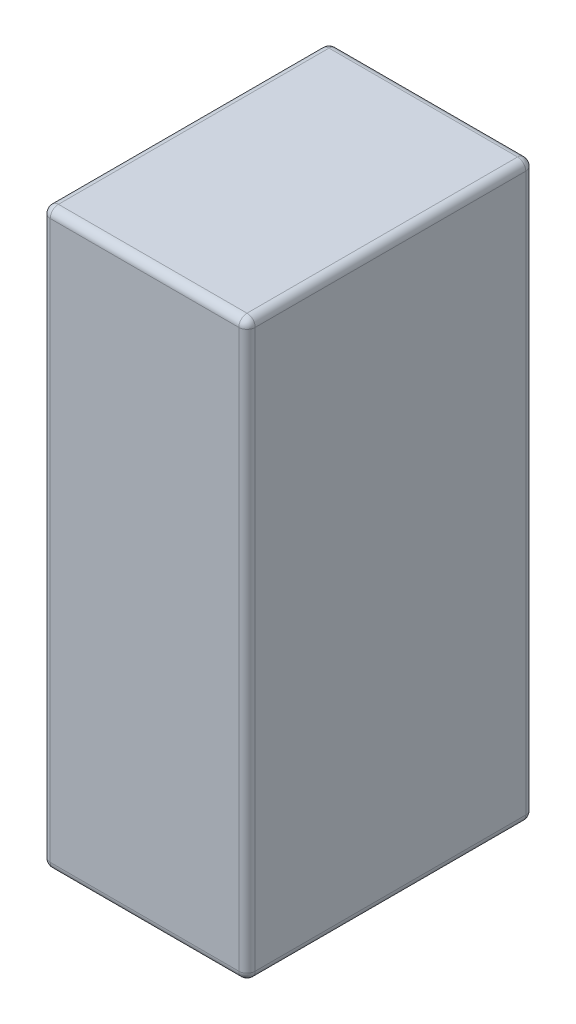
ISO-10303-21;
HEADER;
FILE_DESCRIPTION(('STEP AP214'),'2;1');
FILE_NAME('part.step','',(''),(''),'','','');
FILE_SCHEMA(('AUTOMOTIVE_DESIGN { 1 0 10303 214 1 1 1 1 }'));
ENDSEC;
DATA;
#1=APPLICATION_CONTEXT('core data for automotive mechanical design processes');
#2=APPLICATION_PROTOCOL_DEFINITION('international standard','automotive_design',2000,#1);
#3=PRODUCT_CONTEXT('',#1,'mechanical');
#4=PRODUCT('Part','Part','',(#3));
#5=PRODUCT_RELATED_PRODUCT_CATEGORY('part','',(#4));
#6=PRODUCT_DEFINITION_FORMATION('','',#4);
#7=PRODUCT_DEFINITION_CONTEXT('part definition',#1,'design');
#8=PRODUCT_DEFINITION('design','',#6,#7);
#9=PRODUCT_DEFINITION_SHAPE('','',#8);
#10=(LENGTH_UNIT() NAMED_UNIT(*) SI_UNIT(.MILLI.,.METRE.));
#11=(NAMED_UNIT(*) PLANE_ANGLE_UNIT() SI_UNIT($,.RADIAN.));
#12=(NAMED_UNIT(*) SI_UNIT($,.STERADIAN.) SOLID_ANGLE_UNIT());
#13=UNCERTAINTY_MEASURE_WITH_UNIT(LENGTH_MEASURE(1.E-05),#10,'distance_accuracy_value','');
#14=(GEOMETRIC_REPRESENTATION_CONTEXT(3) GLOBAL_UNCERTAINTY_ASSIGNED_CONTEXT((#13)) GLOBAL_UNIT_ASSIGNED_CONTEXT((#10,
#11,#12)) REPRESENTATION_CONTEXT('',''));
#15=CARTESIAN_POINT('',(0.,0.,0.));
#16=DIRECTION('',(0.,0.,1.));
#17=DIRECTION('',(1.,0.,0.));
#18=AXIS2_PLACEMENT_3D('',#15,#16,#17);
#19=CARTESIAN_POINT('',(0.,70.,0.));
#20=DIRECTION('',(1.,0.,0.));
#21=DIRECTION('',(0.,0.,-1.));
#22=AXIS2_PLACEMENT_3D('',#19,#20,#21);
#23=PLANE('',#22);
#24=DIRECTION('',(0.,-1.,0.));
#25=VECTOR('',#24,1.);
#26=CARTESIAN_POINT('',(0.,70.,-1.));
#27=LINE('',#26,#25);
#28=CARTESIAN_POINT('',(0.,1.,-1.));
#29=VERTEX_POINT('',#28);
#30=CARTESIAN_POINT('',(0.,69.,-1.));
#31=VERTEX_POINT('',#30);
#32=EDGE_CURVE('E136',#29,#31,#27,.F.);
#33=ORIENTED_EDGE('',*,*,#32,.T.);
#34=DIRECTION('',(0.,0.,1.));
#35=VECTOR('',#34,1.);
#36=CARTESIAN_POINT('',(0.,69.,0.));
#37=LINE('',#36,#35);
#38=CARTESIAN_POINT('',(0.,69.,-34.));
#39=VERTEX_POINT('',#38);
#40=EDGE_CURVE('E182',#31,#39,#37,.F.);
#41=ORIENTED_EDGE('',*,*,#40,.T.);
#42=DIRECTION('',(0.,-1.,0.));
#43=VECTOR('',#42,1.);
#44=CARTESIAN_POINT('',(0.,70.,-34.));
#45=LINE('',#44,#43);
#46=CARTESIAN_POINT('',(0.,1.,-34.));
#47=VERTEX_POINT('',#46);
#48=EDGE_CURVE('E177',#39,#47,#45,.T.);
#49=ORIENTED_EDGE('',*,*,#48,.T.);
#50=DIRECTION('',(0.,0.,1.));
#51=VECTOR('',#50,1.);
#52=CARTESIAN_POINT('',(0.,1.,0.));
#53=LINE('',#52,#51);
#54=EDGE_CURVE('E171',#47,#29,#53,.T.);
#55=ORIENTED_EDGE('',*,*,#54,.T.);
#56=EDGE_LOOP('',(#33,#41,#49,#55));
#57=FACE_BOUND('',#56,.T.);
#58=ADVANCED_FACE('F40',(#57),#23,.F.);
#59=CARTESIAN_POINT('',(0.,70.,0.));
#60=DIRECTION('',(0.,0.,-1.));
#61=DIRECTION('',(-1.,0.,0.));
#62=AXIS2_PLACEMENT_3D('',#59,#60,#61);
#63=PLANE('',#62);
#64=DIRECTION('',(0.,-1.,0.));
#65=VECTOR('',#64,1.);
#66=CARTESIAN_POINT('',(24.,70.,0.));
#67=LINE('',#66,#65);
#68=CARTESIAN_POINT('',(24.,1.,0.));
#69=VERTEX_POINT('',#68);
#70=CARTESIAN_POINT('',(24.,69.,0.));
#71=VERTEX_POINT('',#70);
#72=EDGE_CURVE('E161',#69,#71,#67,.F.);
#73=ORIENTED_EDGE('',*,*,#72,.T.);
#74=DIRECTION('',(1.,0.,0.));
#75=VECTOR('',#74,1.);
#76=CARTESIAN_POINT('',(0.,69.,0.));
#77=LINE('',#76,#75);
#78=CARTESIAN_POINT('',(1.,69.,0.));
#79=VERTEX_POINT('',#78);
#80=EDGE_CURVE('E165',#71,#79,#77,.F.);
#81=ORIENTED_EDGE('',*,*,#80,.T.);
#82=DIRECTION('',(0.,-1.,0.));
#83=VECTOR('',#82,1.);
#84=CARTESIAN_POINT('',(1.,70.,0.));
#85=LINE('',#84,#83);
#86=CARTESIAN_POINT('',(1.,1.,0.));
#87=VERTEX_POINT('',#86);
#88=EDGE_CURVE('E134',#79,#87,#85,.T.);
#89=ORIENTED_EDGE('',*,*,#88,.T.);
#90=DIRECTION('',(1.,0.,0.));
#91=VECTOR('',#90,1.);
#92=CARTESIAN_POINT('',(25.,1.,0.));
#93=LINE('',#92,#91);
#94=EDGE_CURVE('E154',#87,#69,#93,.T.);
#95=ORIENTED_EDGE('',*,*,#94,.T.);
#96=EDGE_LOOP('',(#73,#81,#89,#95));
#97=FACE_BOUND('',#96,.T.);
#98=ADVANCED_FACE('F163',(#97),#63,.F.);
#99=CARTESIAN_POINT('',(25.,70.,0.));
#100=DIRECTION('',(-1.,0.,0.));
#101=DIRECTION('',(0.,0.,1.));
#102=AXIS2_PLACEMENT_3D('',#99,#100,#101);
#103=PLANE('',#102);
#104=DIRECTION('',(0.,-1.,0.));
#105=VECTOR('',#104,1.);
#106=CARTESIAN_POINT('',(25.,70.,-34.));
#107=LINE('',#106,#105);
#108=CARTESIAN_POINT('',(25.,1.,-34.));
#109=VERTEX_POINT('',#108);
#110=CARTESIAN_POINT('',(25.,69.,-34.));
#111=VERTEX_POINT('',#110);
#112=EDGE_CURVE('E188',#109,#111,#107,.F.);
#113=ORIENTED_EDGE('',*,*,#112,.T.);
#114=DIRECTION('',(0.,0.,-1.));
#115=VECTOR('',#114,1.);
#116=CARTESIAN_POINT('',(25.,69.,0.));
#117=LINE('',#116,#115);
#118=CARTESIAN_POINT('',(25.,69.,-1.));
#119=VERTEX_POINT('',#118);
#120=EDGE_CURVE('E195',#111,#119,#117,.F.);
#121=ORIENTED_EDGE('',*,*,#120,.T.);
#122=DIRECTION('',(0.,-1.,0.));
#123=VECTOR('',#122,1.);
#124=CARTESIAN_POINT('',(25.,70.,-1.));
#125=LINE('',#124,#123);
#126=CARTESIAN_POINT('',(25.,1.,-1.));
#127=VERTEX_POINT('',#126);
#128=EDGE_CURVE('E191',#119,#127,#125,.T.);
#129=ORIENTED_EDGE('',*,*,#128,.T.);
#130=DIRECTION('',(0.,0.,-1.));
#131=VECTOR('',#130,1.);
#132=CARTESIAN_POINT('',(25.,1.,-35.));
#133=LINE('',#132,#131);
#134=EDGE_CURVE('E185',#127,#109,#133,.T.);
#135=ORIENTED_EDGE('',*,*,#134,.T.);
#136=EDGE_LOOP('',(#113,#121,#129,#135));
#137=FACE_BOUND('',#136,.T.);
#138=ADVANCED_FACE('F334',(#137),#103,.F.);
#139=CARTESIAN_POINT('',(0.,70.,-35.));
#140=DIRECTION('',(0.,0.,1.));
#141=DIRECTION('',(1.,0.,0.));
#142=AXIS2_PLACEMENT_3D('',#139,#140,#141);
#143=PLANE('',#142);
#144=DIRECTION('',(0.,-1.,0.));
#145=VECTOR('',#144,1.);
#146=CARTESIAN_POINT('',(1.,70.,-35.));
#147=LINE('',#146,#145);
#148=CARTESIAN_POINT('',(1.,1.,-35.));
#149=VERTEX_POINT('',#148);
#150=CARTESIAN_POINT('',(1.,69.,-35.));
#151=VERTEX_POINT('',#150);
#152=EDGE_CURVE('E201',#149,#151,#147,.F.);
#153=ORIENTED_EDGE('',*,*,#152,.T.);
#154=DIRECTION('',(-1.,0.,0.));
#155=VECTOR('',#154,1.);
#156=CARTESIAN_POINT('',(0.,69.,-35.));
#157=LINE('',#156,#155);
#158=CARTESIAN_POINT('',(24.,69.,-35.));
#159=VERTEX_POINT('',#158);
#160=EDGE_CURVE('E208',#151,#159,#157,.F.);
#161=ORIENTED_EDGE('',*,*,#160,.T.);
#162=DIRECTION('',(0.,-1.,0.));
#163=VECTOR('',#162,1.);
#164=CARTESIAN_POINT('',(24.,70.,-35.));
#165=LINE('',#164,#163);
#166=CARTESIAN_POINT('',(24.,1.,-35.));
#167=VERTEX_POINT('',#166);
#168=EDGE_CURVE('E204',#159,#167,#165,.T.);
#169=ORIENTED_EDGE('',*,*,#168,.T.);
#170=DIRECTION('',(-1.,0.,0.));
#171=VECTOR('',#170,1.);
#172=CARTESIAN_POINT('',(0.,1.,-35.));
#173=LINE('',#172,#171);
#174=EDGE_CURVE('E198',#167,#149,#173,.T.);
#175=ORIENTED_EDGE('',*,*,#174,.T.);
#176=EDGE_LOOP('',(#153,#161,#169,#175));
#177=FACE_BOUND('',#176,.T.);
#178=ADVANCED_FACE('F344',(#177),#143,.F.);
#179=CARTESIAN_POINT('',(0.,70.,0.));
#180=DIRECTION('',(0.,-1.,0.));
#181=DIRECTION('',(0.,0.,-1.));
#182=AXIS2_PLACEMENT_3D('',#179,#180,#181);
#183=PLANE('',#182);
#184=DIRECTION('',(0.,0.,-1.));
#185=VECTOR('',#184,1.);
#186=CARTESIAN_POINT('',(24.,70.,0.));
#187=LINE('',#186,#185);
#188=CARTESIAN_POINT('',(24.,70.,-1.));
#189=VERTEX_POINT('',#188);
#190=CARTESIAN_POINT('',(24.,70.,-34.));
#191=VERTEX_POINT('',#190);
#192=EDGE_CURVE('E217',#189,#191,#187,.T.);
#193=ORIENTED_EDGE('',*,*,#192,.T.);
#194=DIRECTION('',(-1.,0.,0.));
#195=VECTOR('',#194,1.);
#196=CARTESIAN_POINT('',(0.,70.,-34.));
#197=LINE('',#196,#195);
#198=CARTESIAN_POINT('',(1.,70.,-34.));
#199=VERTEX_POINT('',#198);
#200=EDGE_CURVE('E220',#191,#199,#197,.T.);
#201=ORIENTED_EDGE('',*,*,#200,.T.);
#202=DIRECTION('',(0.,0.,1.));
#203=VECTOR('',#202,1.);
#204=CARTESIAN_POINT('',(1.,70.,0.));
#205=LINE('',#204,#203);
#206=CARTESIAN_POINT('',(1.,70.,-1.));
#207=VERTEX_POINT('',#206);
#208=EDGE_CURVE('E211',#199,#207,#205,.T.);
#209=ORIENTED_EDGE('',*,*,#208,.T.);
#210=DIRECTION('',(1.,0.,0.));
#211=VECTOR('',#210,1.);
#212=CARTESIAN_POINT('',(0.,70.,-1.));
#213=LINE('',#212,#211);
#214=EDGE_CURVE('E214',#207,#189,#213,.T.);
#215=ORIENTED_EDGE('',*,*,#214,.T.);
#216=EDGE_LOOP('',(#193,#201,#209,#215));
#217=FACE_BOUND('',#216,.T.);
#218=ADVANCED_FACE('F326',(#217),#183,.F.);
#219=CARTESIAN_POINT('',(0.,0.,0.));
#220=DIRECTION('',(0.,-1.,0.));
#221=DIRECTION('',(0.,0.,-1.));
#222=AXIS2_PLACEMENT_3D('',#219,#220,#221);
#223=PLANE('',#222);
#224=DIRECTION('',(0.,0.,1.));
#225=VECTOR('',#224,1.);
#226=CARTESIAN_POINT('',(1.,0.,-35.));
#227=LINE('',#226,#225);
#228=CARTESIAN_POINT('',(1.,0.,-1.));
#229=VERTEX_POINT('',#228);
#230=CARTESIAN_POINT('',(1.,0.,-34.));
#231=VERTEX_POINT('',#230);
#232=EDGE_CURVE('E224',#229,#231,#227,.F.);
#233=ORIENTED_EDGE('',*,*,#232,.T.);
#234=DIRECTION('',(-1.,0.,0.));
#235=VECTOR('',#234,1.);
#236=CARTESIAN_POINT('',(25.,0.,-34.));
#237=LINE('',#236,#235);
#238=CARTESIAN_POINT('',(24.,0.,-34.));
#239=VERTEX_POINT('',#238);
#240=EDGE_CURVE('E11',#231,#239,#237,.F.);
#241=ORIENTED_EDGE('',*,*,#240,.T.);
#242=DIRECTION('',(0.,0.,-1.));
#243=VECTOR('',#242,1.);
#244=CARTESIAN_POINT('',(24.,0.,0.));
#245=LINE('',#244,#243);
#246=CARTESIAN_POINT('',(24.,0.,-1.));
#247=VERTEX_POINT('',#246);
#248=EDGE_CURVE('E50',#239,#247,#245,.F.);
#249=ORIENTED_EDGE('',*,*,#248,.T.);
#250=DIRECTION('',(1.,0.,0.));
#251=VECTOR('',#250,1.);
#252=CARTESIAN_POINT('',(0.,0.,-1.));
#253=LINE('',#252,#251);
#254=EDGE_CURVE('E227',#247,#229,#253,.F.);
#255=ORIENTED_EDGE('',*,*,#254,.T.);
#256=EDGE_LOOP('',(#233,#241,#249,#255));
#257=FACE_BOUND('',#256,.T.);
#258=ADVANCED_FACE('F533',(#257),#223,.T.);
#259=CARTESIAN_POINT('',(24.,70.,-34.));
#260=DIRECTION('',(0.,-1.,0.));
#261=DIRECTION('',(0.,0.,-1.));
#262=AXIS2_PLACEMENT_3D('',#259,#260,#261);
#263=CYLINDRICAL_SURFACE('',#262,1.);
#264=CARTESIAN_POINT('',(24.,69.,-34.));
#265=DIRECTION('',(0.,1.,0.));
#266=DIRECTION('',(0.,0.,1.));
#267=AXIS2_PLACEMENT_3D('',#264,#265,#266);
#268=CIRCLE('',#267,1.);
#269=EDGE_CURVE('E44',#111,#159,#268,.T.);
#270=ORIENTED_EDGE('',*,*,#269,.F.);
#271=ORIENTED_EDGE('',*,*,#112,.F.);
#272=CARTESIAN_POINT('',(24.,1.,-34.));
#273=DIRECTION('',(0.,-1.,0.));
#274=DIRECTION('',(0.,0.,-1.));
#275=AXIS2_PLACEMENT_3D('',#272,#273,#274);
#276=CIRCLE('',#275,1.);
#277=EDGE_CURVE('E302',#167,#109,#276,.T.);
#278=ORIENTED_EDGE('',*,*,#277,.F.);
#279=ORIENTED_EDGE('',*,*,#168,.F.);
#280=EDGE_LOOP('',(#270,#271,#278,#279));
#281=FACE_BOUND('',#280,.T.);
#282=ADVANCED_FACE('F42',(#281),#263,.T.);
#283=CARTESIAN_POINT('',(24.,69.,-34.));
#284=DIRECTION('',(0.,0.,1.));
#285=DIRECTION('',(1.,0.,0.));
#286=AXIS2_PLACEMENT_3D('',#283,#284,#285);
#287=SPHERICAL_SURFACE('',#286,1.);
#288=CARTESIAN_POINT('',(24.,69.,-34.));
#289=DIRECTION('',(0.,0.,-1.));
#290=DIRECTION('',(-1.,0.,0.));
#291=AXIS2_PLACEMENT_3D('',#288,#289,#290);
#292=CIRCLE('',#291,1.);
#293=EDGE_CURVE('E295',#111,#191,#292,.F.);
#294=ORIENTED_EDGE('',*,*,#293,.F.);
#295=ORIENTED_EDGE('',*,*,#269,.T.);
#296=CARTESIAN_POINT('',(24.,69.,-34.));
#297=DIRECTION('',(1.,0.,0.));
#298=DIRECTION('',(0.,0.,-1.));
#299=AXIS2_PLACEMENT_3D('',#296,#297,#298);
#300=CIRCLE('',#299,1.);
#301=EDGE_CURVE('E299',#191,#159,#300,.F.);
#302=ORIENTED_EDGE('',*,*,#301,.F.);
#303=EDGE_LOOP('',(#294,#295,#302));
#304=FACE_BOUND('',#303,.T.);
#305=ADVANCED_FACE('F314',(#304),#287,.T.);
#306=CARTESIAN_POINT('',(24.,1.,-34.));
#307=DIRECTION('',(0.,0.,1.));
#308=DIRECTION('',(1.,0.,0.));
#309=AXIS2_PLACEMENT_3D('',#306,#307,#308);
#310=SPHERICAL_SURFACE('',#309,1.);
#311=CARTESIAN_POINT('',(24.,1.,-34.));
#312=DIRECTION('',(1.,0.,0.));
#313=DIRECTION('',(0.,0.,-1.));
#314=AXIS2_PLACEMENT_3D('',#311,#312,#313);
#315=CIRCLE('',#314,1.);
#316=EDGE_CURVE('E288',#167,#239,#315,.F.);
#317=ORIENTED_EDGE('',*,*,#316,.F.);
#318=ORIENTED_EDGE('',*,*,#277,.T.);
#319=CARTESIAN_POINT('',(24.,1.,-34.));
#320=DIRECTION('',(0.,0.,-1.));
#321=DIRECTION('',(-1.,0.,0.));
#322=AXIS2_PLACEMENT_3D('',#319,#320,#321);
#323=CIRCLE('',#322,1.);
#324=EDGE_CURVE('E292',#239,#109,#323,.F.);
#325=ORIENTED_EDGE('',*,*,#324,.F.);
#326=EDGE_LOOP('',(#317,#318,#325));
#327=FACE_BOUND('',#326,.T.);
#328=ADVANCED_FACE('F512',(#327),#310,.T.);
#329=CARTESIAN_POINT('',(0.,69.,-34.));
#330=DIRECTION('',(-1.,0.,0.));
#331=DIRECTION('',(0.,0.,1.));
#332=AXIS2_PLACEMENT_3D('',#329,#330,#331);
#333=CYLINDRICAL_SURFACE('',#332,1.);
#334=ORIENTED_EDGE('',*,*,#301,.T.);
#335=ORIENTED_EDGE('',*,*,#160,.F.);
#336=CARTESIAN_POINT('',(1.,69.,-34.));
#337=DIRECTION('',(-1.,0.,0.));
#338=DIRECTION('',(0.,0.,1.));
#339=AXIS2_PLACEMENT_3D('',#336,#337,#338);
#340=CIRCLE('',#339,1.);
#341=EDGE_CURVE('E280',#199,#151,#340,.T.);
#342=ORIENTED_EDGE('',*,*,#341,.F.);
#343=ORIENTED_EDGE('',*,*,#200,.F.);
#344=EDGE_LOOP('',(#334,#335,#342,#343));
#345=FACE_BOUND('',#344,.T.);
#346=ADVANCED_FACE('F322',(#345),#333,.T.);
#347=CARTESIAN_POINT('',(24.,69.,0.));
#348=DIRECTION('',(0.,0.,-1.));
#349=DIRECTION('',(-1.,0.,0.));
#350=AXIS2_PLACEMENT_3D('',#347,#348,#349);
#351=CYLINDRICAL_SURFACE('',#350,1.);
#352=ORIENTED_EDGE('',*,*,#293,.T.);
#353=ORIENTED_EDGE('',*,*,#192,.F.);
#354=CARTESIAN_POINT('',(24.,69.,-1.));
#355=DIRECTION('',(0.,0.,1.));
#356=DIRECTION('',(1.,0.,0.));
#357=AXIS2_PLACEMENT_3D('',#354,#355,#356);
#358=CIRCLE('',#357,1.);
#359=EDGE_CURVE('E276',#119,#189,#358,.T.);
#360=ORIENTED_EDGE('',*,*,#359,.F.);
#361=ORIENTED_EDGE('',*,*,#120,.F.);
#362=EDGE_LOOP('',(#352,#353,#360,#361));
#363=FACE_BOUND('',#362,.T.);
#364=ADVANCED_FACE('F331',(#363),#351,.T.);
#365=CARTESIAN_POINT('',(24.,70.,-1.));
#366=DIRECTION('',(0.,-1.,0.));
#367=DIRECTION('',(0.,0.,-1.));
#368=AXIS2_PLACEMENT_3D('',#365,#366,#367);
#369=CYLINDRICAL_SURFACE('',#368,1.);
#370=CARTESIAN_POINT('',(24.,1.,-1.));
#371=DIRECTION('',(0.,-1.,0.));
#372=DIRECTION('',(0.,0.,-1.));
#373=AXIS2_PLACEMENT_3D('',#370,#371,#372);
#374=CIRCLE('',#373,1.);
#375=EDGE_CURVE('E268',#127,#69,#374,.T.);
#376=ORIENTED_EDGE('',*,*,#375,.F.);
#377=ORIENTED_EDGE('',*,*,#128,.F.);
#378=CARTESIAN_POINT('',(24.,69.,-1.));
#379=DIRECTION('',(0.,1.,0.));
#380=DIRECTION('',(0.,0.,1.));
#381=AXIS2_PLACEMENT_3D('',#378,#379,#380);
#382=CIRCLE('',#381,1.);
#383=EDGE_CURVE('E272',#71,#119,#382,.T.);
#384=ORIENTED_EDGE('',*,*,#383,.F.);
#385=ORIENTED_EDGE('',*,*,#72,.F.);
#386=EDGE_LOOP('',(#376,#377,#384,#385));
#387=FACE_BOUND('',#386,.T.);
#388=ADVANCED_FACE('F338',(#387),#369,.T.);
#389=CARTESIAN_POINT('',(24.,1.,0.));
#390=DIRECTION('',(0.,0.,1.));
#391=DIRECTION('',(1.,0.,0.));
#392=AXIS2_PLACEMENT_3D('',#389,#390,#391);
#393=CYLINDRICAL_SURFACE('',#392,1.);
#394=ORIENTED_EDGE('',*,*,#324,.T.);
#395=ORIENTED_EDGE('',*,*,#134,.F.);
#396=CARTESIAN_POINT('',(24.,1.,-1.));
#397=DIRECTION('',(0.,0.,1.));
#398=DIRECTION('',(1.,0.,0.));
#399=AXIS2_PLACEMENT_3D('',#396,#397,#398);
#400=CIRCLE('',#399,1.);
#401=EDGE_CURVE('E265',#247,#127,#400,.T.);
#402=ORIENTED_EDGE('',*,*,#401,.F.);
#403=ORIENTED_EDGE('',*,*,#248,.F.);
#404=EDGE_LOOP('',(#394,#395,#402,#403));
#405=FACE_BOUND('',#404,.T.);
#406=ADVANCED_FACE('F342',(#405),#393,.T.);
#407=CARTESIAN_POINT('',(0.,1.,-34.));
#408=DIRECTION('',(1.,0.,0.));
#409=DIRECTION('',(0.,0.,-1.));
#410=AXIS2_PLACEMENT_3D('',#407,#408,#409);
#411=CYLINDRICAL_SURFACE('',#410,1.);
#412=ORIENTED_EDGE('',*,*,#316,.T.);
#413=ORIENTED_EDGE('',*,*,#240,.F.);
#414=CARTESIAN_POINT('',(1.,1.,-34.));
#415=DIRECTION('',(-1.,0.,0.));
#416=DIRECTION('',(0.,0.,1.));
#417=AXIS2_PLACEMENT_3D('',#414,#415,#416);
#418=CIRCLE('',#417,1.);
#419=EDGE_CURVE('E261',#149,#231,#418,.T.);
#420=ORIENTED_EDGE('',*,*,#419,.F.);
#421=ORIENTED_EDGE('',*,*,#174,.F.);
#422=EDGE_LOOP('',(#412,#413,#420,#421));
#423=FACE_BOUND('',#422,.T.);
#424=ADVANCED_FACE('F354',(#423),#411,.T.);
#425=CARTESIAN_POINT('',(1.,70.,-34.));
#426=DIRECTION('',(0.,-1.,0.));
#427=DIRECTION('',(0.,0.,-1.));
#428=AXIS2_PLACEMENT_3D('',#425,#426,#427);
#429=CYLINDRICAL_SURFACE('',#428,1.);
#430=CARTESIAN_POINT('',(1.,69.,-34.));
#431=DIRECTION('',(0.,1.,0.));
#432=DIRECTION('',(0.,0.,1.));
#433=AXIS2_PLACEMENT_3D('',#430,#431,#432);
#434=CIRCLE('',#433,1.);
#435=EDGE_CURVE('E284',#151,#39,#434,.T.);
#436=ORIENTED_EDGE('',*,*,#435,.F.);
#437=ORIENTED_EDGE('',*,*,#152,.F.);
#438=CARTESIAN_POINT('',(1.,1.,-34.));
#439=DIRECTION('',(0.,-1.,0.));
#440=DIRECTION('',(0.,0.,-1.));
#441=AXIS2_PLACEMENT_3D('',#438,#439,#440);
#442=CIRCLE('',#441,1.);
#443=EDGE_CURVE('E257',#47,#149,#442,.T.);
#444=ORIENTED_EDGE('',*,*,#443,.F.);
#445=ORIENTED_EDGE('',*,*,#48,.F.);
#446=EDGE_LOOP('',(#436,#437,#444,#445));
#447=FACE_BOUND('',#446,.T.);
#448=ADVANCED_FACE('F349',(#447),#429,.T.);
#449=CARTESIAN_POINT('',(1.,69.,-34.));
#450=DIRECTION('',(0.,0.,1.));
#451=DIRECTION('',(1.,0.,0.));
#452=AXIS2_PLACEMENT_3D('',#449,#450,#451);
#453=SPHERICAL_SURFACE('',#452,1.);
#454=ORIENTED_EDGE('',*,*,#341,.T.);
#455=ORIENTED_EDGE('',*,*,#435,.T.);
#456=CARTESIAN_POINT('',(1.,69.,-34.));
#457=DIRECTION('',(0.,0.,-1.));
#458=DIRECTION('',(-1.,0.,0.));
#459=AXIS2_PLACEMENT_3D('',#456,#457,#458);
#460=CIRCLE('',#459,1.);
#461=EDGE_CURVE('E253',#199,#39,#460,.F.);
#462=ORIENTED_EDGE('',*,*,#461,.F.);
#463=EDGE_LOOP('',(#454,#455,#462));
#464=FACE_BOUND('',#463,.T.);
#465=ADVANCED_FACE('F365',(#464),#453,.T.);
#466=CARTESIAN_POINT('',(24.,69.,-1.));
#467=DIRECTION('',(0.,0.,1.));
#468=DIRECTION('',(1.,0.,0.));
#469=AXIS2_PLACEMENT_3D('',#466,#467,#468);
#470=SPHERICAL_SURFACE('',#469,1.);
#471=ORIENTED_EDGE('',*,*,#383,.T.);
#472=ORIENTED_EDGE('',*,*,#359,.T.);
#473=CARTESIAN_POINT('',(24.,69.,-1.));
#474=DIRECTION('',(1.,0.,0.));
#475=DIRECTION('',(0.,0.,-1.));
#476=AXIS2_PLACEMENT_3D('',#473,#474,#475);
#477=CIRCLE('',#476,1.);
#478=EDGE_CURVE('E249',#71,#189,#477,.F.);
#479=ORIENTED_EDGE('',*,*,#478,.F.);
#480=EDGE_LOOP('',(#471,#472,#479));
#481=FACE_BOUND('',#480,.T.);
#482=ADVANCED_FACE('F375',(#481),#470,.T.);
#483=CARTESIAN_POINT('',(24.,1.,-1.));
#484=DIRECTION('',(0.,0.,1.));
#485=DIRECTION('',(1.,0.,0.));
#486=AXIS2_PLACEMENT_3D('',#483,#484,#485);
#487=SPHERICAL_SURFACE('',#486,1.);
#488=ORIENTED_EDGE('',*,*,#401,.T.);
#489=ORIENTED_EDGE('',*,*,#375,.T.);
#490=CARTESIAN_POINT('',(24.,1.,-1.));
#491=DIRECTION('',(1.,0.,0.));
#492=DIRECTION('',(0.,0.,-1.));
#493=AXIS2_PLACEMENT_3D('',#490,#491,#492);
#494=CIRCLE('',#493,1.);
#495=EDGE_CURVE('E157',#247,#69,#494,.F.);
#496=ORIENTED_EDGE('',*,*,#495,.F.);
#497=EDGE_LOOP('',(#488,#489,#496));
#498=FACE_BOUND('',#497,.T.);
#499=ADVANCED_FACE('F377',(#498),#487,.T.);
#500=CARTESIAN_POINT('',(1.,1.,-34.));
#501=DIRECTION('',(0.,0.,1.));
#502=DIRECTION('',(1.,0.,0.));
#503=AXIS2_PLACEMENT_3D('',#500,#501,#502);
#504=SPHERICAL_SURFACE('',#503,1.);
#505=ORIENTED_EDGE('',*,*,#443,.T.);
#506=ORIENTED_EDGE('',*,*,#419,.T.);
#507=CARTESIAN_POINT('',(1.,1.,-34.));
#508=DIRECTION('',(0.,0.,-1.));
#509=DIRECTION('',(-1.,0.,0.));
#510=AXIS2_PLACEMENT_3D('',#507,#508,#509);
#511=CIRCLE('',#510,1.);
#512=EDGE_CURVE('E243',#47,#231,#511,.F.);
#513=ORIENTED_EDGE('',*,*,#512,.F.);
#514=EDGE_LOOP('',(#505,#506,#513));
#515=FACE_BOUND('',#514,.T.);
#516=ADVANCED_FACE('F356',(#515),#504,.T.);
#517=CARTESIAN_POINT('',(1.,69.,0.));
#518=DIRECTION('',(0.,0.,1.));
#519=DIRECTION('',(1.,0.,0.));
#520=AXIS2_PLACEMENT_3D('',#517,#518,#519);
#521=CYLINDRICAL_SURFACE('',#520,1.);
#522=ORIENTED_EDGE('',*,*,#461,.T.);
#523=ORIENTED_EDGE('',*,*,#40,.F.);
#524=CARTESIAN_POINT('',(1.,69.,-1.));
#525=DIRECTION('',(0.,0.,1.));
#526=DIRECTION('',(1.,0.,0.));
#527=AXIS2_PLACEMENT_3D('',#524,#525,#526);
#528=CIRCLE('',#527,1.);
#529=EDGE_CURVE('E239',#207,#31,#528,.T.);
#530=ORIENTED_EDGE('',*,*,#529,.F.);
#531=ORIENTED_EDGE('',*,*,#208,.F.);
#532=EDGE_LOOP('',(#522,#523,#530,#531));
#533=FACE_BOUND('',#532,.T.);
#534=ADVANCED_FACE('F367',(#533),#521,.T.);
#535=CARTESIAN_POINT('',(0.,69.,-1.));
#536=DIRECTION('',(1.,0.,0.));
#537=DIRECTION('',(0.,0.,-1.));
#538=AXIS2_PLACEMENT_3D('',#535,#536,#537);
#539=CYLINDRICAL_SURFACE('',#538,1.);
#540=ORIENTED_EDGE('',*,*,#478,.T.);
#541=ORIENTED_EDGE('',*,*,#214,.F.);
#542=CARTESIAN_POINT('',(1.,69.,-1.));
#543=DIRECTION('',(-1.,0.,0.));
#544=DIRECTION('',(0.,0.,1.));
#545=AXIS2_PLACEMENT_3D('',#542,#543,#544);
#546=CIRCLE('',#545,1.);
#547=EDGE_CURVE('E151',#79,#207,#546,.T.);
#548=ORIENTED_EDGE('',*,*,#547,.F.);
#549=ORIENTED_EDGE('',*,*,#80,.F.);
#550=EDGE_LOOP('',(#540,#541,#548,#549));
#551=FACE_BOUND('',#550,.T.);
#552=ADVANCED_FACE('F373',(#551),#539,.T.);
#553=CARTESIAN_POINT('',(0.,1.,-1.));
#554=DIRECTION('',(-1.,0.,0.));
#555=DIRECTION('',(0.,0.,1.));
#556=AXIS2_PLACEMENT_3D('',#553,#554,#555);
#557=CYLINDRICAL_SURFACE('',#556,1.);
#558=ORIENTED_EDGE('',*,*,#495,.T.);
#559=ORIENTED_EDGE('',*,*,#94,.F.);
#560=CARTESIAN_POINT('',(1.,1.,-1.));
#561=DIRECTION('',(-1.,0.,0.));
#562=DIRECTION('',(0.,0.,1.));
#563=AXIS2_PLACEMENT_3D('',#560,#561,#562);
#564=CIRCLE('',#563,1.);
#565=EDGE_CURVE('E143',#229,#87,#564,.T.);
#566=ORIENTED_EDGE('',*,*,#565,.F.);
#567=ORIENTED_EDGE('',*,*,#254,.F.);
#568=EDGE_LOOP('',(#558,#559,#566,#567));
#569=FACE_BOUND('',#568,.T.);
#570=ADVANCED_FACE('F155',(#569),#557,.T.);
#571=CARTESIAN_POINT('',(1.,1.,0.));
#572=DIRECTION('',(0.,0.,-1.));
#573=DIRECTION('',(-1.,0.,0.));
#574=AXIS2_PLACEMENT_3D('',#571,#572,#573);
#575=CYLINDRICAL_SURFACE('',#574,1.);
#576=ORIENTED_EDGE('',*,*,#512,.T.);
#577=ORIENTED_EDGE('',*,*,#232,.F.);
#578=CARTESIAN_POINT('',(1.,1.,-1.));
#579=DIRECTION('',(0.,0.,1.));
#580=DIRECTION('',(1.,0.,0.));
#581=AXIS2_PLACEMENT_3D('',#578,#579,#580);
#582=CIRCLE('',#581,1.);
#583=EDGE_CURVE('E147',#29,#229,#582,.T.);
#584=ORIENTED_EDGE('',*,*,#583,.F.);
#585=ORIENTED_EDGE('',*,*,#54,.F.);
#586=EDGE_LOOP('',(#576,#577,#584,#585));
#587=FACE_BOUND('',#586,.T.);
#588=ADVANCED_FACE('F360',(#587),#575,.T.);
#589=CARTESIAN_POINT('',(1.,69.,-1.));
#590=DIRECTION('',(0.,0.,1.));
#591=DIRECTION('',(1.,0.,0.));
#592=AXIS2_PLACEMENT_3D('',#589,#590,#591);
#593=SPHERICAL_SURFACE('',#592,1.);
#594=ORIENTED_EDGE('',*,*,#547,.T.);
#595=ORIENTED_EDGE('',*,*,#529,.T.);
#596=CARTESIAN_POINT('',(1.,69.,-1.));
#597=DIRECTION('',(0.,1.,0.));
#598=DIRECTION('',(0.,0.,1.));
#599=AXIS2_PLACEMENT_3D('',#596,#597,#598);
#600=CIRCLE('',#599,1.);
#601=EDGE_CURVE('E140',#79,#31,#600,.F.);
#602=ORIENTED_EDGE('',*,*,#601,.F.);
#603=EDGE_LOOP('',(#594,#595,#602));
#604=FACE_BOUND('',#603,.T.);
#605=ADVANCED_FACE('F371',(#604),#593,.T.);
#606=CARTESIAN_POINT('',(1.,1.,-1.));
#607=DIRECTION('',(0.,0.,1.));
#608=DIRECTION('',(1.,0.,0.));
#609=AXIS2_PLACEMENT_3D('',#606,#607,#608);
#610=SPHERICAL_SURFACE('',#609,1.);
#611=ORIENTED_EDGE('',*,*,#583,.T.);
#612=ORIENTED_EDGE('',*,*,#565,.T.);
#613=CARTESIAN_POINT('',(1.,1.,-1.));
#614=DIRECTION('',(0.,-1.,0.));
#615=DIRECTION('',(0.,0.,-1.));
#616=AXIS2_PLACEMENT_3D('',#613,#614,#615);
#617=CIRCLE('',#616,1.);
#618=EDGE_CURVE('E130',#29,#87,#617,.F.);
#619=ORIENTED_EDGE('',*,*,#618,.F.);
#620=EDGE_LOOP('',(#611,#612,#619));
#621=FACE_BOUND('',#620,.T.);
#622=ADVANCED_FACE('F145',(#621),#610,.T.);
#623=CARTESIAN_POINT('',(1.,70.,-1.));
#624=DIRECTION('',(0.,-1.,0.));
#625=DIRECTION('',(0.,0.,-1.));
#626=AXIS2_PLACEMENT_3D('',#623,#624,#625);
#627=CYLINDRICAL_SURFACE('',#626,1.);
#628=ORIENTED_EDGE('',*,*,#601,.T.);
#629=ORIENTED_EDGE('',*,*,#32,.F.);
#630=ORIENTED_EDGE('',*,*,#618,.T.);
#631=ORIENTED_EDGE('',*,*,#88,.F.);
#632=EDGE_LOOP('',(#628,#629,#630,#631));
#633=FACE_BOUND('',#632,.T.);
#634=ADVANCED_FACE('F132',(#633),#627,.T.);
#635=CLOSED_SHELL('',(#58,#98,#138,#178,#218,#258,#282,#305,#328,#346,#364,#388,#406,#424,#448,
#465,#482,#499,#516,#534,#552,#570,#588,#605,#622,#634));
#636=MANIFOLD_SOLID_BREP('B2',#635);
#637=ADVANCED_BREP_SHAPE_REPRESENTATION('',(#18,#636),#14);
#638=SHAPE_DEFINITION_REPRESENTATION(#9,#637);
ENDSEC;
END-ISO-10303-21;
